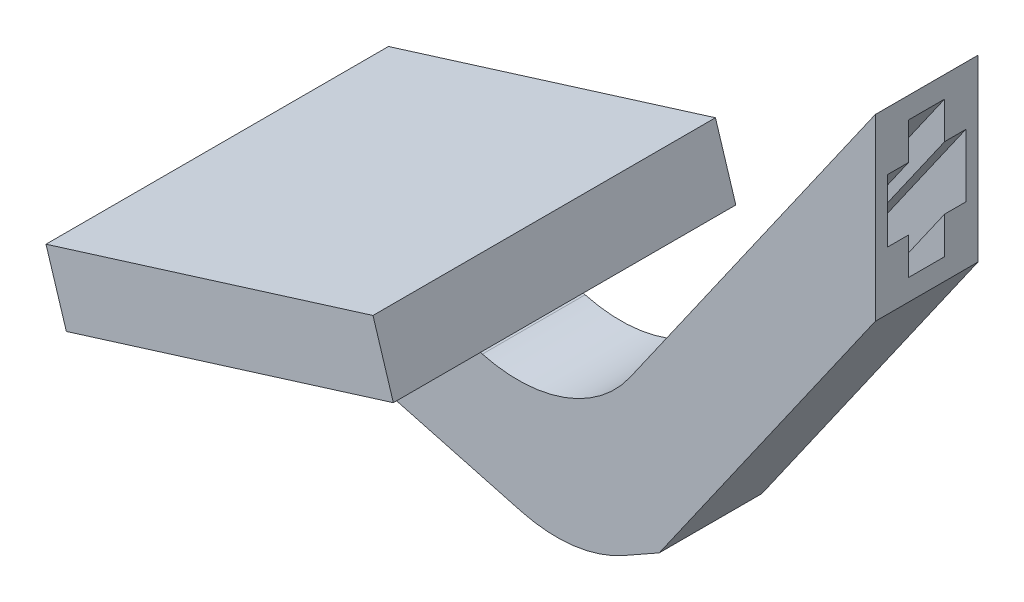
ISO-10303-21;
HEADER;
FILE_DESCRIPTION(('STEP AP214'),'2;1');
FILE_NAME('part.step','',(''),(''),'','','');
FILE_SCHEMA(('AUTOMOTIVE_DESIGN { 1 0 10303 214 1 1 1 1 }'));
ENDSEC;
DATA;
#1=APPLICATION_CONTEXT('core data for automotive mechanical design processes');
#2=APPLICATION_PROTOCOL_DEFINITION('international standard','automotive_design',2000,#1);
#3=PRODUCT_CONTEXT('',#1,'mechanical');
#4=PRODUCT('Part','Part','',(#3));
#5=PRODUCT_RELATED_PRODUCT_CATEGORY('part','',(#4));
#6=PRODUCT_DEFINITION_FORMATION('','',#4);
#7=PRODUCT_DEFINITION_CONTEXT('part definition',#1,'design');
#8=PRODUCT_DEFINITION('design','',#6,#7);
#9=PRODUCT_DEFINITION_SHAPE('','',#8);
#10=(LENGTH_UNIT() NAMED_UNIT(*) SI_UNIT(.MILLI.,.METRE.));
#11=(NAMED_UNIT(*) PLANE_ANGLE_UNIT() SI_UNIT($,.RADIAN.));
#12=(NAMED_UNIT(*) SI_UNIT($,.STERADIAN.) SOLID_ANGLE_UNIT());
#13=UNCERTAINTY_MEASURE_WITH_UNIT(LENGTH_MEASURE(1.E-05),#10,'distance_accuracy_value','');
#14=(GEOMETRIC_REPRESENTATION_CONTEXT(3) GLOBAL_UNCERTAINTY_ASSIGNED_CONTEXT((#13)) GLOBAL_UNIT_ASSIGNED_CONTEXT((#10,
#11,#12)) REPRESENTATION_CONTEXT('',''));
#15=CARTESIAN_POINT('',(0.,0.,0.));
#16=DIRECTION('',(0.,0.,1.));
#17=DIRECTION('',(1.,0.,0.));
#18=AXIS2_PLACEMENT_3D('',#15,#16,#17);
#19=CARTESIAN_POINT('',(-87.1977369383555,0.,17.5));
#20=DIRECTION('',(-1.,0.,0.));
#21=DIRECTION('',(0.,0.,1.));
#22=AXIS2_PLACEMENT_3D('',#19,#20,#21);
#23=PLANE('',#22);
#24=DIRECTION('',(0.,-1.,0.));
#25=VECTOR('',#24,1.);
#26=CARTESIAN_POINT('',(-87.1977369383555,-19.5936198643126,5.25));
#27=LINE('',#26,#25);
#28=CARTESIAN_POINT('',(-87.1977369383555,-42.8393625791956,5.25));
#29=VERTEX_POINT('',#28);
#30=CARTESIAN_POINT('',(-87.1977369383555,-61.1455539332173,5.25));
#31=VERTEX_POINT('',#30);
#32=EDGE_CURVE('E278',#29,#31,#27,.T.);
#33=ORIENTED_EDGE('',*,*,#32,.T.);
#34=DIRECTION('',(0.,0.,-1.));
#35=VECTOR('',#34,1.);
#36=CARTESIAN_POINT('',(-87.1977369383555,-61.1455539332173,17.5));
#37=LINE('',#36,#35);
#38=CARTESIAN_POINT('',(-87.1977369383555,-61.1455539332173,-5.25));
#39=VERTEX_POINT('',#38);
#40=EDGE_CURVE('E274',#31,#39,#37,.T.);
#41=ORIENTED_EDGE('',*,*,#40,.T.);
#42=DIRECTION('',(0.,1.,0.));
#43=VECTOR('',#42,1.);
#44=CARTESIAN_POINT('',(-87.1977369383555,0.,-5.25));
#45=LINE('',#44,#43);
#46=CARTESIAN_POINT('',(-87.1977369383555,-42.8393625791956,-5.25));
#47=VERTEX_POINT('',#46);
#48=EDGE_CURVE('E277',#39,#47,#45,.T.);
#49=ORIENTED_EDGE('',*,*,#48,.T.);
#50=DIRECTION('',(0.,0.,-1.));
#51=VECTOR('',#50,1.);
#52=CARTESIAN_POINT('',(-87.1977369383555,-42.8393625791956,17.5));
#53=LINE('',#52,#51);
#54=EDGE_CURVE('E197',#29,#47,#53,.T.);
#55=ORIENTED_EDGE('',*,*,#54,.F.);
#56=EDGE_LOOP('',(#33,#41,#49,#55));
#57=FACE_BOUND('',#56,.T.);
#58=DIRECTION('',(0.,1.,0.));
#59=VECTOR('',#58,1.);
#60=CARTESIAN_POINT('',(-87.1977369383555,0.,-1.84000000000011));
#61=LINE('',#60,#59);
#62=CARTESIAN_POINT('',(-87.1977369383555,-58.9662454386908,-1.84000000000017));
#63=VERTEX_POINT('',#62);
#64=CARTESIAN_POINT('',(-87.1977369383555,-55.2004003601493,-1.84000000000014));
#65=VERTEX_POINT('',#64);
#66=EDGE_CURVE('E12',#63,#65,#61,.T.);
#67=ORIENTED_EDGE('',*,*,#66,.F.);
#68=DIRECTION('',(0.,0.,1.));
#69=VECTOR('',#68,1.);
#70=CARTESIAN_POINT('',(-87.1977369383555,-58.9662454386908,17.5));
#71=LINE('',#70,#69);
#72=CARTESIAN_POINT('',(-87.1977369383555,-58.9662454386908,1.83999999999985));
#73=VERTEX_POINT('',#72);
#74=EDGE_CURVE('E182',#63,#73,#71,.T.);
#75=ORIENTED_EDGE('',*,*,#74,.T.);
#76=DIRECTION('',(0.,1.,0.));
#77=VECTOR('',#76,1.);
#78=CARTESIAN_POINT('',(-87.1977369383555,0.,1.83999999999989));
#79=LINE('',#78,#77);
#80=CARTESIAN_POINT('',(-87.1977369383555,-55.2004003601493,1.83999999999985));
#81=VERTEX_POINT('',#80);
#82=EDGE_CURVE('E388',#73,#81,#79,.T.);
#83=ORIENTED_EDGE('',*,*,#82,.T.);
#84=DIRECTION('',(0.,0.,1.));
#85=VECTOR('',#84,1.);
#86=CARTESIAN_POINT('',(-87.1977369383555,-55.2004003601492,17.5000000000001));
#87=LINE('',#86,#85);
#88=CARTESIAN_POINT('',(-87.1977369383555,-55.2004003601493,3.99999999999985));
#89=VERTEX_POINT('',#88);
#90=EDGE_CURVE('E385',#81,#89,#87,.T.);
#91=ORIENTED_EDGE('',*,*,#90,.T.);
#92=DIRECTION('',(0.,1.,0.));
#93=VECTOR('',#92,1.);
#94=CARTESIAN_POINT('',(-87.1977369383555,0.,3.99999999999988));
#95=LINE('',#94,#93);
#96=CARTESIAN_POINT('',(-87.1977369383555,-48.7845161522636,3.99999999999987));
#97=VERTEX_POINT('',#96);
#98=EDGE_CURVE('E382',#89,#97,#95,.T.);
#99=ORIENTED_EDGE('',*,*,#98,.T.);
#100=DIRECTION('',(0.,0.,1.));
#101=VECTOR('',#100,1.);
#102=CARTESIAN_POINT('',(-87.1977369383555,-48.7845161522636,17.5));
#103=LINE('',#102,#101);
#104=CARTESIAN_POINT('',(-87.1977369383555,-48.7845161522636,1.83999999999985));
#105=VERTEX_POINT('',#104);
#106=EDGE_CURVE('E379',#105,#97,#103,.T.);
#107=ORIENTED_EDGE('',*,*,#106,.F.);
#108=DIRECTION('',(0.,1.,0.));
#109=VECTOR('',#108,1.);
#110=CARTESIAN_POINT('',(-87.1977369383555,0.,1.83999999999989));
#111=LINE('',#110,#109);
#112=CARTESIAN_POINT('',(-87.1977369383555,-45.018671073722,1.83999999999987));
#113=VERTEX_POINT('',#112);
#114=EDGE_CURVE('E376',#105,#113,#111,.T.);
#115=ORIENTED_EDGE('',*,*,#114,.T.);
#116=DIRECTION('',(0.,0.,1.));
#117=VECTOR('',#116,1.);
#118=CARTESIAN_POINT('',(-87.1977369383555,-45.018671073722,17.5));
#119=LINE('',#118,#117);
#120=CARTESIAN_POINT('',(-87.1977369383555,-45.018671073722,-1.84000000000015));
#121=VERTEX_POINT('',#120);
#122=EDGE_CURVE('E373',#121,#113,#119,.T.);
#123=ORIENTED_EDGE('',*,*,#122,.F.);
#124=DIRECTION('',(0.,1.,0.));
#125=VECTOR('',#124,1.);
#126=CARTESIAN_POINT('',(-87.1977369383555,0.,-1.84000000000011));
#127=LINE('',#126,#125);
#128=CARTESIAN_POINT('',(-87.1977369383555,-48.7845161522636,-1.84000000000015));
#129=VERTEX_POINT('',#128);
#130=EDGE_CURVE('E370',#129,#121,#127,.T.);
#131=ORIENTED_EDGE('',*,*,#130,.F.);
#132=DIRECTION('',(0.,0.,1.));
#133=VECTOR('',#132,1.);
#134=CARTESIAN_POINT('',(-87.1977369383555,-48.7845161522636,17.5));
#135=LINE('',#134,#133);
#136=CARTESIAN_POINT('',(-87.1977369383555,-48.7845161522636,-4.00000000000016));
#137=VERTEX_POINT('',#136);
#138=EDGE_CURVE('E367',#137,#129,#135,.T.);
#139=ORIENTED_EDGE('',*,*,#138,.F.);
#140=DIRECTION('',(0.,1.,0.));
#141=VECTOR('',#140,1.);
#142=CARTESIAN_POINT('',(-87.1977369383555,0.,-4.00000000000012));
#143=LINE('',#142,#141);
#144=CARTESIAN_POINT('',(-87.1977369383555,-55.2004003601493,-4.00000000000017));
#145=VERTEX_POINT('',#144);
#146=EDGE_CURVE('E364',#145,#137,#143,.T.);
#147=ORIENTED_EDGE('',*,*,#146,.F.);
#148=DIRECTION('',(0.,0.,1.));
#149=VECTOR('',#148,1.);
#150=CARTESIAN_POINT('',(-87.1977369383555,-55.2004003601492,17.5000000000001));
#151=LINE('',#150,#149);
#152=EDGE_CURVE('E291',#145,#65,#151,.T.);
#153=ORIENTED_EDGE('',*,*,#152,.T.);
#154=EDGE_LOOP('',(#67,#75,#83,#91,#99,#107,#115,#123,#131,#139,#147,#153));
#155=FACE_BOUND('',#154,.T.);
#156=ADVANCED_FACE('F175',(#57,#155),#23,.F.);
#157=CARTESIAN_POINT('',(-76.0767929010446,-19.5936198643126,-5.25));
#158=DIRECTION('',(0.,0.,-1.));
#159=DIRECTION('',(-1.,-3.63042929052426E-13,0.));
#160=AXIS2_PLACEMENT_3D('',#157,#158,#159);
#161=PLANE('',#160);
#162=ORIENTED_EDGE('',*,*,#48,.F.);
#163=DIRECTION('',(-0.573576436351044,-0.819152044288993,0.));
#164=VECTOR('',#163,1.);
#165=CARTESIAN_POINT('',(-50.198458454352,-8.30510811539095,-5.25));
#166=LINE('',#165,#164);
#167=CARTESIAN_POINT('',(-109.280511790734,-92.6830248219769,-5.25));
#168=VERTEX_POINT('',#167);
#169=EDGE_CURVE('E287',#39,#168,#166,.T.);
#170=ORIENTED_EDGE('',*,*,#169,.T.);
#171=DIRECTION('',(0.871154090420245,0.491009725712308,0.));
#172=VECTOR('',#171,1.);
#173=CARTESIAN_POINT('',(-20.944061808536,-42.8938353397413,-5.25));
#174=LINE('',#173,#172);
#175=CARTESIAN_POINT('',(-112.90358333254,-94.7251014000941,-5.25));
#176=VERTEX_POINT('',#175);
#177=EDGE_CURVE('E309',#176,#168,#174,.T.);
#178=ORIENTED_EDGE('',*,*,#177,.F.);
#179=CARTESIAN_POINT('',(-119.777719492512,-82.5289441342107,-5.25));
#180=DIRECTION('',(0.,0.,-1.));
#181=DIRECTION('',(-1.,0.,0.));
#182=AXIS2_PLACEMENT_3D('',#179,#180,#181);
#183=CIRCLE('',#182,14.);
#184=CARTESIAN_POINT('',(-123.401186123948,-96.0519057022576,-5.25));
#185=VERTEX_POINT('',#184);
#186=EDGE_CURVE('E297',#176,#185,#183,.T.);
#187=ORIENTED_EDGE('',*,*,#186,.T.);
#188=DIRECTION('',(-0.96592582628907,0.258819045102514,0.));
#189=VECTOR('',#188,1.);
#190=CARTESIAN_POINT('',(-59.1749641176493,-113.261270021747,-5.25));
#191=LINE('',#190,#189);
#192=CARTESIAN_POINT('',(-150.293052318357,-88.8462518725002,-5.25));
#193=VERTEX_POINT('',#192);
#194=EDGE_CURVE('E300',#185,#193,#191,.T.);
#195=ORIENTED_EDGE('',*,*,#194,.T.);
#196=DIRECTION('',(0.954811797841029,0.297211087787083,0.));
#197=VECTOR('',#196,1.);
#198=CARTESIAN_POINT('',(-150.293052318357,-88.8462518725002,-5.25));
#199=LINE('',#198,#197);
#200=CARTESIAN_POINT('',(-131.525949988818,-83.0044818916663,-5.25));
#201=VERTEX_POINT('',#200);
#202=EDGE_CURVE('E314',#193,#201,#199,.T.);
#203=ORIENTED_EDGE('',*,*,#202,.T.);
#204=DIRECTION('',(-0.96592582628907,0.258819045102514,0.));
#205=VECTOR('',#204,1.);
#206=CARTESIAN_POINT('',(-56.4573641440729,-103.119048845712,-5.25));
#207=LINE('',#206,#205);
#208=CARTESIAN_POINT('',(-127.350487884635,-84.1232935905088,-5.25));
#209=VERTEX_POINT('',#208);
#210=EDGE_CURVE('E315',#209,#201,#207,.T.);
#211=ORIENTED_EDGE('',*,*,#210,.F.);
#212=CARTESIAN_POINT('',(-123.7270212532,-70.6003320224618,-5.25));
#213=DIRECTION('',(0.,0.,-1.));
#214=DIRECTION('',(-1.,0.,0.));
#215=AXIS2_PLACEMENT_3D('',#212,#213,#214);
#216=CIRCLE('',#215,14.);
#217=CARTESIAN_POINT('',(-112.258892633154,-78.6304021313765,-5.25));
#218=VERTEX_POINT('',#217);
#219=EDGE_CURVE('E321',#209,#218,#216,.F.);
#220=ORIENTED_EDGE('',*,*,#219,.T.);
#221=DIRECTION('',(0.573576436351044,0.819152044288994,0.));
#222=VECTOR('',#221,1.);
#223=CARTESIAN_POINT('',(-58.7995549193865,-2.28255553370498,-5.25));
#224=LINE('',#223,#222);
#225=EDGE_CURVE('E290',#218,#47,#224,.T.);
#226=ORIENTED_EDGE('',*,*,#225,.T.);
#227=EDGE_LOOP('',(#162,#170,#178,#187,#195,#203,#211,#220,#226));
#228=FACE_BOUND('',#227,.T.);
#229=ADVANCED_FACE('F285',(#228),#161,.T.);
#230=CARTESIAN_POINT('',(-50.198458454352,-8.30510811539095,100.697652672067));
#231=DIRECTION('',(0.819152044288993,-0.573576436351044,0.));
#232=DIRECTION('',(0.573576436351044,0.819152044288993,0.));
#233=AXIS2_PLACEMENT_3D('',#230,#231,#232);
#234=PLANE('',#233);
#235=ORIENTED_EDGE('',*,*,#40,.F.);
#236=DIRECTION('',(-0.573576436351044,-0.819152044288993,0.));
#237=VECTOR('',#236,1.);
#238=CARTESIAN_POINT('',(-50.198458454352,-8.30510811539095,5.25));
#239=LINE('',#238,#237);
#240=CARTESIAN_POINT('',(-109.280511790734,-92.6830248219769,5.25));
#241=VERTEX_POINT('',#240);
#242=EDGE_CURVE('E307',#31,#241,#239,.T.);
#243=ORIENTED_EDGE('',*,*,#242,.T.);
#244=DIRECTION('',(0.,0.,-1.));
#245=VECTOR('',#244,1.);
#246=CARTESIAN_POINT('',(-109.280511790734,-92.6830248219769,100.697652672067));
#247=LINE('',#246,#245);
#248=EDGE_CURVE('E296',#241,#168,#247,.T.);
#249=ORIENTED_EDGE('',*,*,#248,.T.);
#250=ORIENTED_EDGE('',*,*,#169,.F.);
#251=EDGE_LOOP('',(#235,#243,#249,#250));
#252=FACE_BOUND('',#251,.T.);
#253=ADVANCED_FACE('F294',(#252),#234,.T.);
#254=CARTESIAN_POINT('',(-20.944061808536,-42.8938353397413,100.697652672067));
#255=DIRECTION('',(-0.491009725712308,0.871154090420245,0.));
#256=DIRECTION('',(-0.871154090420245,-0.491009725712308,0.));
#257=AXIS2_PLACEMENT_3D('',#254,#255,#256);
#258=PLANE('',#257);
#259=DIRECTION('',(0.871154090420245,0.491009725712308,0.));
#260=VECTOR('',#259,1.);
#261=CARTESIAN_POINT('',(-20.944061808536,-42.8938353397413,5.25));
#262=LINE('',#261,#260);
#263=CARTESIAN_POINT('',(-112.90358333254,-94.7251014000941,5.25));
#264=VERTEX_POINT('',#263);
#265=EDGE_CURVE('E352',#264,#241,#262,.T.);
#266=ORIENTED_EDGE('',*,*,#265,.F.);
#267=DIRECTION('',(0.,0.,-1.));
#268=VECTOR('',#267,1.);
#269=CARTESIAN_POINT('',(-112.90358333254,-94.7251014000941,-5.25));
#270=LINE('',#269,#268);
#271=EDGE_CURVE('E312',#264,#176,#270,.T.);
#272=ORIENTED_EDGE('',*,*,#271,.T.);
#273=ORIENTED_EDGE('',*,*,#177,.T.);
#274=ORIENTED_EDGE('',*,*,#248,.F.);
#275=EDGE_LOOP('',(#266,#272,#273,#274));
#276=FACE_BOUND('',#275,.T.);
#277=ADVANCED_FACE('F507',(#276),#258,.F.);
#278=CARTESIAN_POINT('',(-59.1749641176493,-113.261270021747,100.697652672067));
#279=DIRECTION('',(-0.258819045102514,-0.96592582628907,0.));
#280=DIRECTION('',(0.96592582628907,-0.258819045102514,0.));
#281=AXIS2_PLACEMENT_3D('',#278,#279,#280);
#282=PLANE('',#281);
#283=ORIENTED_EDGE('',*,*,#194,.F.);
#284=DIRECTION('',(0.,0.,-1.));
#285=VECTOR('',#284,1.);
#286=CARTESIAN_POINT('',(-123.401186123948,-96.0519057022576,5.25));
#287=LINE('',#286,#285);
#288=CARTESIAN_POINT('',(-123.401186123948,-96.0519057022576,5.25));
#289=VERTEX_POINT('',#288);
#290=EDGE_CURVE('E311',#185,#289,#287,.F.);
#291=ORIENTED_EDGE('',*,*,#290,.T.);
#292=DIRECTION('',(-0.96592582628907,0.258819045102514,0.));
#293=VECTOR('',#292,1.);
#294=CARTESIAN_POINT('',(-59.1749641176493,-113.261270021747,5.25));
#295=LINE('',#294,#293);
#296=CARTESIAN_POINT('',(-150.293052318357,-88.8462518725002,5.25));
#297=VERTEX_POINT('',#296);
#298=EDGE_CURVE('E488',#289,#297,#295,.T.);
#299=ORIENTED_EDGE('',*,*,#298,.T.);
#300=DIRECTION('',(0.,0.,-1.));
#301=VECTOR('',#300,1.);
#302=CARTESIAN_POINT('',(-150.293052318357,-88.8462518725002,100.697652672067));
#303=LINE('',#302,#301);
#304=EDGE_CURVE('E319',#297,#193,#303,.T.);
#305=ORIENTED_EDGE('',*,*,#304,.T.);
#306=EDGE_LOOP('',(#283,#291,#299,#305));
#307=FACE_BOUND('',#306,.T.);
#308=ADVANCED_FACE('F512',(#307),#282,.T.);
#309=CARTESIAN_POINT('',(-56.4573641440729,-103.119048845712,100.697652672067));
#310=DIRECTION('',(-0.258819045102514,-0.96592582628907,0.));
#311=DIRECTION('',(0.96592582628907,-0.258819045102514,0.));
#312=AXIS2_PLACEMENT_3D('',#309,#310,#311);
#313=PLANE('',#312);
#314=ORIENTED_EDGE('',*,*,#210,.T.);
#315=DIRECTION('',(0.,0.,1.));
#316=VECTOR('',#315,1.);
#317=CARTESIAN_POINT('',(-131.525949988818,-83.0044818916663,-5.25));
#318=LINE('',#317,#316);
#319=CARTESIAN_POINT('',(-131.525949988818,-83.0044818916664,5.25));
#320=VERTEX_POINT('',#319);
#321=EDGE_CURVE('E318',#201,#320,#318,.T.);
#322=ORIENTED_EDGE('',*,*,#321,.T.);
#323=DIRECTION('',(-0.96592582628907,0.258819045102514,0.));
#324=VECTOR('',#323,1.);
#325=CARTESIAN_POINT('',(-56.4573641440729,-103.119048845712,5.25));
#326=LINE('',#325,#324);
#327=CARTESIAN_POINT('',(-127.350487884635,-84.1232935905088,5.25));
#328=VERTEX_POINT('',#327);
#329=EDGE_CURVE('E480',#328,#320,#326,.T.);
#330=ORIENTED_EDGE('',*,*,#329,.F.);
#331=DIRECTION('',(0.,0.,-1.));
#332=VECTOR('',#331,1.);
#333=CARTESIAN_POINT('',(-127.350487884635,-84.1232935905088,100.697652672067));
#334=LINE('',#333,#332);
#335=EDGE_CURVE('E329',#328,#209,#334,.T.);
#336=ORIENTED_EDGE('',*,*,#335,.T.);
#337=EDGE_LOOP('',(#314,#322,#330,#336));
#338=FACE_BOUND('',#337,.T.);
#339=ADVANCED_FACE('F806',(#338),#313,.F.);
#340=CARTESIAN_POINT('',(-58.7995549193865,-2.28255553370498,100.697652672067));
#341=DIRECTION('',(-0.819152044288993,0.573576436351044,0.));
#342=DIRECTION('',(-0.573576436351044,-0.819152044288994,0.));
#343=AXIS2_PLACEMENT_3D('',#340,#341,#342);
#344=PLANE('',#343);
#345=ORIENTED_EDGE('',*,*,#54,.T.);
#346=ORIENTED_EDGE('',*,*,#225,.F.);
#347=DIRECTION('',(0.,0.,-1.));
#348=VECTOR('',#347,1.);
#349=CARTESIAN_POINT('',(-112.258892633154,-78.6304021313764,100.697652672067));
#350=LINE('',#349,#348);
#351=CARTESIAN_POINT('',(-112.258892633154,-78.6304021313765,5.25));
#352=VERTEX_POINT('',#351);
#353=EDGE_CURVE('E360',#218,#352,#350,.F.);
#354=ORIENTED_EDGE('',*,*,#353,.T.);
#355=DIRECTION('',(0.573576436351044,0.819152044288994,0.));
#356=VECTOR('',#355,1.);
#357=CARTESIAN_POINT('',(-58.7995549193865,-2.28255553370498,5.25));
#358=LINE('',#357,#356);
#359=EDGE_CURVE('E481',#352,#29,#358,.T.);
#360=ORIENTED_EDGE('',*,*,#359,.T.);
#361=EDGE_LOOP('',(#345,#346,#354,#360));
#362=FACE_BOUND('',#361,.T.);
#363=ADVANCED_FACE('F526',(#362),#344,.T.);
#364=CARTESIAN_POINT('',(-76.0767929010446,-19.5936198643126,5.25));
#365=DIRECTION('',(0.,0.,1.));
#366=DIRECTION('',(-1.,-3.63042929052426E-13,0.));
#367=AXIS2_PLACEMENT_3D('',#364,#365,#366);
#368=PLANE('',#367);
#369=ORIENTED_EDGE('',*,*,#32,.F.);
#370=ORIENTED_EDGE('',*,*,#359,.F.);
#371=CARTESIAN_POINT('',(-123.7270212532,-70.6003320224618,5.25));
#372=DIRECTION('',(0.,0.,1.));
#373=DIRECTION('',(1.,0.,0.));
#374=AXIS2_PLACEMENT_3D('',#371,#372,#373);
#375=CIRCLE('',#374,14.);
#376=EDGE_CURVE('E478',#352,#328,#375,.F.);
#377=ORIENTED_EDGE('',*,*,#376,.T.);
#378=ORIENTED_EDGE('',*,*,#329,.T.);
#379=DIRECTION('',(0.954811797841029,0.297211087787083,0.));
#380=VECTOR('',#379,1.);
#381=CARTESIAN_POINT('',(-150.293052318357,-88.8462518725002,5.25));
#382=LINE('',#381,#380);
#383=EDGE_CURVE('E323',#297,#320,#382,.T.);
#384=ORIENTED_EDGE('',*,*,#383,.F.);
#385=ORIENTED_EDGE('',*,*,#298,.F.);
#386=CARTESIAN_POINT('',(-119.777719492512,-82.5289441342107,5.25));
#387=DIRECTION('',(0.,0.,1.));
#388=DIRECTION('',(1.,0.,0.));
#389=AXIS2_PLACEMENT_3D('',#386,#387,#388);
#390=CIRCLE('',#389,14.);
#391=EDGE_CURVE('E486',#289,#264,#390,.T.);
#392=ORIENTED_EDGE('',*,*,#391,.T.);
#393=ORIENTED_EDGE('',*,*,#265,.T.);
#394=ORIENTED_EDGE('',*,*,#242,.F.);
#395=EDGE_LOOP('',(#369,#370,#377,#378,#384,#385,#392,#393,#394));
#396=FACE_BOUND('',#395,.T.);
#397=ADVANCED_FACE('F502',(#396),#368,.T.);
#398=CARTESIAN_POINT('',(-119.777719492512,-82.5289441342107,100.697652672067));
#399=DIRECTION('',(0.,0.,1.));
#400=DIRECTION('',(1.,0.,0.));
#401=AXIS2_PLACEMENT_3D('',#398,#399,#400);
#402=CYLINDRICAL_SURFACE('',#401,14.);
#403=ORIENTED_EDGE('',*,*,#391,.F.);
#404=ORIENTED_EDGE('',*,*,#290,.F.);
#405=ORIENTED_EDGE('',*,*,#186,.F.);
#406=ORIENTED_EDGE('',*,*,#271,.F.);
#407=EDGE_LOOP('',(#403,#404,#405,#406));
#408=FACE_BOUND('',#407,.T.);
#409=ADVANCED_FACE('F515',(#408),#402,.T.);
#410=CARTESIAN_POINT('',(-123.7270212532,-70.6003320224618,100.697652672067));
#411=DIRECTION('',(0.,0.,-1.));
#412=DIRECTION('',(-1.,0.,0.));
#413=AXIS2_PLACEMENT_3D('',#410,#411,#412);
#414=CYLINDRICAL_SURFACE('',#413,14.);
#415=ORIENTED_EDGE('',*,*,#376,.F.);
#416=ORIENTED_EDGE('',*,*,#353,.F.);
#417=ORIENTED_EDGE('',*,*,#219,.F.);
#418=ORIENTED_EDGE('',*,*,#335,.F.);
#419=EDGE_LOOP('',(#415,#416,#417,#418));
#420=FACE_BOUND('',#419,.T.);
#421=ADVANCED_FACE('F517',(#420),#414,.F.);
#422=CARTESIAN_POINT('',(-126.280772305879,-74.0404902609221,17.5));
#423=DIRECTION('',(-0.954811797841029,-0.297211087787083,0.));
#424=DIRECTION('',(0.297211087787083,-0.954811797841029,0.));
#425=AXIS2_PLACEMENT_3D('',#422,#423,#424);
#426=PLANE('',#425);
#427=DIRECTION('',(0.,0.,-1.));
#428=VECTOR('',#427,1.);
#429=CARTESIAN_POINT('',(-124.200294691369,-80.7241728458093,17.5));
#430=LINE('',#429,#428);
#431=CARTESIAN_POINT('',(-124.200294691369,-80.7241728458093,17.5));
#432=VERTEX_POINT('',#431);
#433=CARTESIAN_POINT('',(-124.200294691369,-80.7241728458093,-17.5));
#434=VERTEX_POINT('',#433);
#435=EDGE_CURVE('E346',#432,#434,#430,.T.);
#436=ORIENTED_EDGE('',*,*,#435,.T.);
#437=DIRECTION('',(0.297211087787083,-0.954811797841029,0.));
#438=VECTOR('',#437,1.);
#439=CARTESIAN_POINT('',(-126.280772305879,-74.0404902609221,-17.5));
#440=LINE('',#439,#438);
#441=CARTESIAN_POINT('',(-126.280772305879,-74.0404902609221,-17.5));
#442=VERTEX_POINT('',#441);
#443=EDGE_CURVE('E330',#442,#434,#440,.T.);
#444=ORIENTED_EDGE('',*,*,#443,.F.);
#445=DIRECTION('',(0.,0.,-1.));
#446=VECTOR('',#445,1.);
#447=CARTESIAN_POINT('',(-126.280772305879,-74.0404902609221,17.5));
#448=LINE('',#447,#446);
#449=CARTESIAN_POINT('',(-126.280772305879,-74.0404902609221,17.5));
#450=VERTEX_POINT('',#449);
#451=EDGE_CURVE('E342',#450,#442,#448,.T.);
#452=ORIENTED_EDGE('',*,*,#451,.F.);
#453=DIRECTION('',(0.297211087787083,-0.954811797841029,0.));
#454=VECTOR('',#453,1.);
#455=CARTESIAN_POINT('',(-126.280772305879,-74.0404902609221,17.5));
#456=LINE('',#455,#454);
#457=EDGE_CURVE('E343',#450,#432,#456,.T.);
#458=ORIENTED_EDGE('',*,*,#457,.T.);
#459=EDGE_LOOP('',(#436,#444,#452,#458));
#460=FACE_BOUND('',#459,.T.);
#461=ADVANCED_FACE('F523',(#460),#426,.F.);
#462=CARTESIAN_POINT('',(-159.699185230315,-84.44287833347,-17.5));
#463=DIRECTION('',(0.,0.,1.));
#464=DIRECTION('',(1.,0.,0.));
#465=AXIS2_PLACEMENT_3D('',#462,#463,#464);
#466=PLANE('',#465);
#467=DIRECTION('',(-0.954811797841029,-0.297211087787083,0.));
#468=VECTOR('',#467,1.);
#469=CARTESIAN_POINT('',(-157.618707615805,-91.1265609183572,-17.5));
#470=LINE('',#469,#468);
#471=CARTESIAN_POINT('',(-157.618707615805,-91.1265609183572,-17.5));
#472=VERTEX_POINT('',#471);
#473=EDGE_CURVE('E334',#434,#472,#470,.T.);
#474=ORIENTED_EDGE('',*,*,#473,.T.);
#475=DIRECTION('',(0.297211087787083,-0.954811797841029,0.));
#476=VECTOR('',#475,1.);
#477=CARTESIAN_POINT('',(-159.699185230315,-84.44287833347,-17.5));
#478=LINE('',#477,#476);
#479=CARTESIAN_POINT('',(-159.699185230315,-84.44287833347,-17.5));
#480=VERTEX_POINT('',#479);
#481=EDGE_CURVE('E335',#480,#472,#478,.T.);
#482=ORIENTED_EDGE('',*,*,#481,.F.);
#483=DIRECTION('',(-0.954811797841029,-0.297211087787083,0.));
#484=VECTOR('',#483,1.);
#485=CARTESIAN_POINT('',(-159.699185230315,-84.44287833347,-17.5));
#486=LINE('',#485,#484);
#487=EDGE_CURVE('E356',#442,#480,#486,.T.);
#488=ORIENTED_EDGE('',*,*,#487,.F.);
#489=ORIENTED_EDGE('',*,*,#443,.T.);
#490=EDGE_LOOP('',(#474,#482,#488,#489));
#491=FACE_BOUND('',#490,.T.);
#492=ADVANCED_FACE('F541',(#491),#466,.F.);
#493=CARTESIAN_POINT('',(-159.699185230315,-84.44287833347,17.5));
#494=DIRECTION('',(0.954811797841029,0.297211087787083,0.));
#495=DIRECTION('',(-0.297211087787083,0.954811797841029,0.));
#496=AXIS2_PLACEMENT_3D('',#493,#494,#495);
#497=PLANE('',#496);
#498=DIRECTION('',(0.,0.,1.));
#499=VECTOR('',#498,1.);
#500=CARTESIAN_POINT('',(-157.618707615805,-91.1265609183572,17.5));
#501=LINE('',#500,#499);
#502=CARTESIAN_POINT('',(-157.618707615805,-91.1265609183572,17.5));
#503=VERTEX_POINT('',#502);
#504=EDGE_CURVE('E333',#472,#503,#501,.T.);
#505=ORIENTED_EDGE('',*,*,#504,.T.);
#506=DIRECTION('',(0.297211087787083,-0.954811797841029,0.));
#507=VECTOR('',#506,1.);
#508=CARTESIAN_POINT('',(-159.699185230315,-84.44287833347,17.5));
#509=LINE('',#508,#507);
#510=CARTESIAN_POINT('',(-159.699185230315,-84.44287833347,17.5));
#511=VERTEX_POINT('',#510);
#512=EDGE_CURVE('E339',#511,#503,#509,.T.);
#513=ORIENTED_EDGE('',*,*,#512,.F.);
#514=DIRECTION('',(0.,0.,1.));
#515=VECTOR('',#514,1.);
#516=CARTESIAN_POINT('',(-159.699185230315,-84.44287833347,17.5));
#517=LINE('',#516,#515);
#518=EDGE_CURVE('E354',#480,#511,#517,.T.);
#519=ORIENTED_EDGE('',*,*,#518,.F.);
#520=ORIENTED_EDGE('',*,*,#481,.T.);
#521=EDGE_LOOP('',(#505,#513,#519,#520));
#522=FACE_BOUND('',#521,.T.);
#523=ADVANCED_FACE('F545',(#522),#497,.F.);
#524=CARTESIAN_POINT('',(-159.699185230315,-84.44287833347,17.5));
#525=DIRECTION('',(0.,0.,-1.));
#526=DIRECTION('',(-1.,0.,0.));
#527=AXIS2_PLACEMENT_3D('',#524,#525,#526);
#528=PLANE('',#527);
#529=DIRECTION('',(0.954811797841029,0.297211087787083,0.));
#530=VECTOR('',#529,1.);
#531=CARTESIAN_POINT('',(-157.618707615805,-91.1265609183572,17.5));
#532=LINE('',#531,#530);
#533=EDGE_CURVE('E338',#503,#432,#532,.T.);
#534=ORIENTED_EDGE('',*,*,#533,.T.);
#535=ORIENTED_EDGE('',*,*,#457,.F.);
#536=DIRECTION('',(0.954811797841029,0.297211087787083,0.));
#537=VECTOR('',#536,1.);
#538=CARTESIAN_POINT('',(-159.699185230315,-84.44287833347,17.5));
#539=LINE('',#538,#537);
#540=EDGE_CURVE('E326',#511,#450,#539,.T.);
#541=ORIENTED_EDGE('',*,*,#540,.F.);
#542=ORIENTED_EDGE('',*,*,#512,.T.);
#543=EDGE_LOOP('',(#534,#535,#541,#542));
#544=FACE_BOUND('',#543,.T.);
#545=ADVANCED_FACE('F549',(#544),#528,.F.);
#546=CARTESIAN_POINT('',(-26.7706104917019,-43.0652514698485,0.));
#547=DIRECTION('',(0.297211087787083,-0.954811797841029,0.));
#548=DIRECTION('',(0.954811797841029,0.297211087787083,0.));
#549=AXIS2_PLACEMENT_3D('',#546,#547,#548);
#550=PLANE('',#549);
#551=ORIENTED_EDGE('',*,*,#451,.T.);
#552=ORIENTED_EDGE('',*,*,#487,.T.);
#553=ORIENTED_EDGE('',*,*,#518,.T.);
#554=ORIENTED_EDGE('',*,*,#540,.T.);
#555=EDGE_LOOP('',(#551,#552,#553,#554));
#556=FACE_BOUND('',#555,.T.);
#557=ADVANCED_FACE('F553',(#556),#550,.F.);
#558=CARTESIAN_POINT('',(-24.6901328771923,-49.7489340547357,0.));
#559=DIRECTION('',(0.297211087787083,-0.954811797841029,0.));
#560=DIRECTION('',(0.954811797841029,0.297211087787083,0.));
#561=AXIS2_PLACEMENT_3D('',#558,#559,#560);
#562=PLANE('',#561);
#563=ORIENTED_EDGE('',*,*,#321,.F.);
#564=ORIENTED_EDGE('',*,*,#202,.F.);
#565=ORIENTED_EDGE('',*,*,#304,.F.);
#566=ORIENTED_EDGE('',*,*,#383,.T.);
#567=EDGE_LOOP('',(#563,#564,#565,#566));
#568=FACE_BOUND('',#567,.T.);
#569=ORIENTED_EDGE('',*,*,#435,.F.);
#570=ORIENTED_EDGE('',*,*,#533,.F.);
#571=ORIENTED_EDGE('',*,*,#504,.F.);
#572=ORIENTED_EDGE('',*,*,#473,.F.);
#573=EDGE_LOOP('',(#569,#570,#571,#572));
#574=FACE_BOUND('',#573,.T.);
#575=ADVANCED_FACE('F555',(#568,#574),#562,.T.);
#576=CARTESIAN_POINT('',(-66.0223867644648,-94.2897400580278,-1.84000000000016));
#577=DIRECTION('',(0.,0.,1.));
#578=DIRECTION('',(1.,0.,0.));
#579=AXIS2_PLACEMENT_3D('',#576,#577,#578);
#580=PLANE('',#579);
#581=ORIENTED_EDGE('',*,*,#66,.T.);
#582=DIRECTION('',(0.573576436351045,0.819152044288993,0.));
#583=VECTOR('',#582,1.);
#584=CARTESIAN_POINT('',(-98.5972420348779,-71.4805808415943,-1.84000000000018));
#585=LINE('',#584,#583);
#586=CARTESIAN_POINT('',(-98.5972420348779,-71.4805808415943,-1.84000000000018));
#587=VERTEX_POINT('',#586);
#588=EDGE_CURVE('E189',#587,#65,#585,.T.);
#589=ORIENTED_EDGE('',*,*,#588,.F.);
#590=DIRECTION('',(0.819152044288993,-0.573576436351045,0.));
#591=VECTOR('',#590,1.);
#592=CARTESIAN_POINT('',(-66.0223867644648,-94.2897400580278,-1.84000000000016));
#593=LINE('',#592,#591);
#594=CARTESIAN_POINT('',(-96.8278736192137,-72.7195059441126,-1.84000000000019));
#595=VERTEX_POINT('',#594);
#596=EDGE_CURVE('E408',#587,#595,#593,.T.);
#597=ORIENTED_EDGE('',*,*,#596,.T.);
#598=DIRECTION('',(0.573576436351045,0.819152044288993,0.));
#599=VECTOR('',#598,1.);
#600=CARTESIAN_POINT('',(-96.8278736192137,-72.7195059441126,-1.84000000000019));
#601=LINE('',#600,#599);
#602=EDGE_CURVE('E298',#595,#63,#601,.T.);
#603=ORIENTED_EDGE('',*,*,#602,.T.);
#604=EDGE_LOOP('',(#581,#589,#597,#603));
#605=FACE_BOUND('',#604,.T.);
#606=ADVANCED_FACE('F406',(#605),#580,.T.);
#607=CARTESIAN_POINT('',(-96.8278736192137,-72.7195059441126,-1.87800169490315E-13));
#608=DIRECTION('',(0.819152044288993,-0.573576436351045,0.));
#609=DIRECTION('',(0.573576436351045,0.819152044288993,0.));
#610=AXIS2_PLACEMENT_3D('',#607,#608,#609);
#611=PLANE('',#610);
#612=ORIENTED_EDGE('',*,*,#602,.F.);
#613=DIRECTION('',(0.,0.,-1.));
#614=VECTOR('',#613,1.);
#615=CARTESIAN_POINT('',(-96.8278736192137,-72.7195059441126,-1.87800169490315E-13));
#616=LINE('',#615,#614);
#617=CARTESIAN_POINT('',(-96.8278736192137,-72.7195059441126,1.83999999999982));
#618=VERTEX_POINT('',#617);
#619=EDGE_CURVE('E446',#618,#595,#616,.T.);
#620=ORIENTED_EDGE('',*,*,#619,.F.);
#621=DIRECTION('',(0.573576436351045,0.819152044288993,0.));
#622=VECTOR('',#621,1.);
#623=CARTESIAN_POINT('',(-96.8278736192137,-72.7195059441126,1.83999999999982));
#624=LINE('',#623,#622);
#625=EDGE_CURVE('E303',#618,#73,#624,.T.);
#626=ORIENTED_EDGE('',*,*,#625,.T.);
#627=ORIENTED_EDGE('',*,*,#74,.F.);
#628=EDGE_LOOP('',(#612,#620,#626,#627));
#629=FACE_BOUND('',#628,.T.);
#630=ADVANCED_FACE('F399',(#629),#611,.F.);
#631=CARTESIAN_POINT('',(-66.0223867644648,-94.2897400580278,1.83999999999985));
#632=DIRECTION('',(0.,0.,1.));
#633=DIRECTION('',(1.,0.,0.));
#634=AXIS2_PLACEMENT_3D('',#631,#632,#633);
#635=PLANE('',#634);
#636=ORIENTED_EDGE('',*,*,#625,.F.);
#637=DIRECTION('',(0.819152044288993,-0.573576436351045,0.));
#638=VECTOR('',#637,1.);
#639=CARTESIAN_POINT('',(-66.0223867644648,-94.2897400580278,1.83999999999985));
#640=LINE('',#639,#638);
#641=CARTESIAN_POINT('',(-98.5972420348779,-71.4805808415943,1.83999999999982));
#642=VERTEX_POINT('',#641);
#643=EDGE_CURVE('E443',#642,#618,#640,.T.);
#644=ORIENTED_EDGE('',*,*,#643,.F.);
#645=DIRECTION('',(0.573576436351045,0.819152044288993,0.));
#646=VECTOR('',#645,1.);
#647=CARTESIAN_POINT('',(-98.5972420348779,-71.4805808415943,1.83999999999982));
#648=LINE('',#647,#646);
#649=EDGE_CURVE('E449',#642,#81,#648,.T.);
#650=ORIENTED_EDGE('',*,*,#649,.T.);
#651=ORIENTED_EDGE('',*,*,#82,.F.);
#652=EDGE_LOOP('',(#636,#644,#650,#651));
#653=FACE_BOUND('',#652,.T.);
#654=ADVANCED_FACE('F591',(#653),#635,.F.);
#655=CARTESIAN_POINT('',(-98.5972420348779,-71.4805808415943,-2.24524743674427E-13));
#656=DIRECTION('',(0.819152044288993,-0.573576436351045,0.));
#657=DIRECTION('',(0.573576436351045,0.819152044288993,0.));
#658=AXIS2_PLACEMENT_3D('',#655,#656,#657);
#659=PLANE('',#658);
#660=ORIENTED_EDGE('',*,*,#649,.F.);
#661=DIRECTION('',(0.,0.,-1.));
#662=VECTOR('',#661,1.);
#663=CARTESIAN_POINT('',(-98.5972420348779,-71.4805808415943,-2.24524743674427E-13));
#664=LINE('',#663,#662);
#665=CARTESIAN_POINT('',(-98.5972420348779,-71.4805808415943,3.99999999999982));
#666=VERTEX_POINT('',#665);
#667=EDGE_CURVE('E440',#666,#642,#664,.T.);
#668=ORIENTED_EDGE('',*,*,#667,.F.);
#669=DIRECTION('',(0.573576436351045,0.819152044288993,0.));
#670=VECTOR('',#669,1.);
#671=CARTESIAN_POINT('',(-98.5972420348779,-71.4805808415943,3.99999999999982));
#672=LINE('',#671,#670);
#673=EDGE_CURVE('E452',#666,#89,#672,.T.);
#674=ORIENTED_EDGE('',*,*,#673,.T.);
#675=ORIENTED_EDGE('',*,*,#90,.F.);
#676=EDGE_LOOP('',(#660,#668,#674,#675));
#677=FACE_BOUND('',#676,.T.);
#678=ADVANCED_FACE('F598',(#677),#659,.F.);
#679=CARTESIAN_POINT('',(-66.0223867644648,-94.2897400580278,3.99999999999985));
#680=DIRECTION('',(0.,0.,1.));
#681=DIRECTION('',(1.,0.,0.));
#682=AXIS2_PLACEMENT_3D('',#679,#680,#681);
#683=PLANE('',#682);
#684=ORIENTED_EDGE('',*,*,#673,.F.);
#685=DIRECTION('',(0.819152044288993,-0.573576436351045,0.));
#686=VECTOR('',#685,1.);
#687=CARTESIAN_POINT('',(-66.0223867644648,-94.2897400580278,3.99999999999985));
#688=LINE('',#687,#686);
#689=CARTESIAN_POINT('',(-101.611721557861,-69.3698195558225,3.99999999999984));
#690=VERTEX_POINT('',#689);
#691=EDGE_CURVE('E437',#690,#666,#688,.T.);
#692=ORIENTED_EDGE('',*,*,#691,.F.);
#693=DIRECTION('',(0.573576436351045,0.819152044288993,0.));
#694=VECTOR('',#693,1.);
#695=CARTESIAN_POINT('',(-101.611721557861,-69.3698195558225,3.99999999999984));
#696=LINE('',#695,#694);
#697=EDGE_CURVE('E455',#690,#97,#696,.T.);
#698=ORIENTED_EDGE('',*,*,#697,.T.);
#699=ORIENTED_EDGE('',*,*,#98,.F.);
#700=EDGE_LOOP('',(#684,#692,#698,#699));
#701=FACE_BOUND('',#700,.T.);
#702=ADVANCED_FACE('F606',(#701),#683,.F.);
#703=CARTESIAN_POINT('',(-101.611721557861,-69.3698195558225,-1.66185583932989E-13));
#704=DIRECTION('',(0.819152044288993,-0.573576436351045,0.));
#705=DIRECTION('',(0.573576436351045,0.819152044288993,0.));
#706=AXIS2_PLACEMENT_3D('',#703,#704,#705);
#707=PLANE('',#706);
#708=ORIENTED_EDGE('',*,*,#106,.T.);
#709=ORIENTED_EDGE('',*,*,#697,.F.);
#710=DIRECTION('',(0.,0.,-1.));
#711=VECTOR('',#710,1.);
#712=CARTESIAN_POINT('',(-101.611721557861,-69.3698195558225,-1.66185583932989E-13));
#713=LINE('',#712,#711);
#714=CARTESIAN_POINT('',(-101.611721557861,-69.3698195558225,1.83999999999982));
#715=VERTEX_POINT('',#714);
#716=EDGE_CURVE('E434',#690,#715,#713,.T.);
#717=ORIENTED_EDGE('',*,*,#716,.T.);
#718=DIRECTION('',(0.573576436351045,0.819152044288993,0.));
#719=VECTOR('',#718,1.);
#720=CARTESIAN_POINT('',(-101.611721557861,-69.3698195558225,1.83999999999982));
#721=LINE('',#720,#719);
#722=EDGE_CURVE('E458',#715,#105,#721,.T.);
#723=ORIENTED_EDGE('',*,*,#722,.T.);
#724=EDGE_LOOP('',(#708,#709,#717,#723));
#725=FACE_BOUND('',#724,.T.);
#726=ADVANCED_FACE('F614',(#725),#707,.T.);
#727=CARTESIAN_POINT('',(-66.0223867644648,-94.2897400580278,1.83999999999985));
#728=DIRECTION('',(0.,0.,1.));
#729=DIRECTION('',(1.,0.,0.));
#730=AXIS2_PLACEMENT_3D('',#727,#728,#729);
#731=PLANE('',#730);
#732=ORIENTED_EDGE('',*,*,#722,.F.);
#733=DIRECTION('',(0.819152044288993,-0.573576436351045,0.));
#734=VECTOR('',#733,1.);
#735=CARTESIAN_POINT('',(-66.0223867644648,-94.2897400580278,1.83999999999985));
#736=LINE('',#735,#734);
#737=CARTESIAN_POINT('',(-103.381089973526,-68.1308944533042,1.83999999999984));
#738=VERTEX_POINT('',#737);
#739=EDGE_CURVE('E431',#738,#715,#736,.T.);
#740=ORIENTED_EDGE('',*,*,#739,.F.);
#741=DIRECTION('',(0.573576436351045,0.819152044288993,0.));
#742=VECTOR('',#741,1.);
#743=CARTESIAN_POINT('',(-103.381089973526,-68.1308944533042,1.83999999999984));
#744=LINE('',#743,#742);
#745=EDGE_CURVE('E461',#738,#113,#744,.T.);
#746=ORIENTED_EDGE('',*,*,#745,.T.);
#747=ORIENTED_EDGE('',*,*,#114,.F.);
#748=EDGE_LOOP('',(#732,#740,#746,#747));
#749=FACE_BOUND('',#748,.T.);
#750=ADVANCED_FACE('F622',(#749),#731,.F.);
#751=CARTESIAN_POINT('',(-103.381089973526,-68.1308944533042,-1.87800169490315E-13));
#752=DIRECTION('',(0.819152044288993,-0.573576436351045,0.));
#753=DIRECTION('',(0.573576436351045,0.819152044288993,0.));
#754=AXIS2_PLACEMENT_3D('',#751,#752,#753);
#755=PLANE('',#754);
#756=ORIENTED_EDGE('',*,*,#122,.T.);
#757=ORIENTED_EDGE('',*,*,#745,.F.);
#758=DIRECTION('',(0.,0.,-1.));
#759=VECTOR('',#758,1.);
#760=CARTESIAN_POINT('',(-103.381089973526,-68.1308944533042,-1.87800169490315E-13));
#761=LINE('',#760,#759);
#762=CARTESIAN_POINT('',(-103.381089973526,-68.1308944533042,-1.8400000000002));
#763=VERTEX_POINT('',#762);
#764=EDGE_CURVE('E428',#738,#763,#761,.T.);
#765=ORIENTED_EDGE('',*,*,#764,.T.);
#766=DIRECTION('',(0.573576436351045,0.819152044288993,0.));
#767=VECTOR('',#766,1.);
#768=CARTESIAN_POINT('',(-103.381089973526,-68.1308944533042,-1.8400000000002));
#769=LINE('',#768,#767);
#770=EDGE_CURVE('E464',#763,#121,#769,.T.);
#771=ORIENTED_EDGE('',*,*,#770,.T.);
#772=EDGE_LOOP('',(#756,#757,#765,#771));
#773=FACE_BOUND('',#772,.T.);
#774=ADVANCED_FACE('F630',(#773),#755,.T.);
#775=CARTESIAN_POINT('',(-66.0223867644648,-94.2897400580278,-1.84000000000016));
#776=DIRECTION('',(0.,0.,1.));
#777=DIRECTION('',(1.,0.,0.));
#778=AXIS2_PLACEMENT_3D('',#775,#776,#777);
#779=PLANE('',#778);
#780=ORIENTED_EDGE('',*,*,#130,.T.);
#781=ORIENTED_EDGE('',*,*,#770,.F.);
#782=DIRECTION('',(0.819152044288993,-0.573576436351045,0.));
#783=VECTOR('',#782,1.);
#784=CARTESIAN_POINT('',(-66.0223867644648,-94.2897400580278,-1.84000000000016));
#785=LINE('',#784,#783);
#786=CARTESIAN_POINT('',(-101.611721557861,-69.3698195558225,-1.84000000000018));
#787=VERTEX_POINT('',#786);
#788=EDGE_CURVE('E425',#763,#787,#785,.T.);
#789=ORIENTED_EDGE('',*,*,#788,.T.);
#790=DIRECTION('',(0.573576436351045,0.819152044288993,0.));
#791=VECTOR('',#790,1.);
#792=CARTESIAN_POINT('',(-101.611721557861,-69.3698195558225,-1.84000000000018));
#793=LINE('',#792,#791);
#794=EDGE_CURVE('E467',#787,#129,#793,.T.);
#795=ORIENTED_EDGE('',*,*,#794,.T.);
#796=EDGE_LOOP('',(#780,#781,#789,#795));
#797=FACE_BOUND('',#796,.T.);
#798=ADVANCED_FACE('F638',(#797),#779,.T.);
#799=CARTESIAN_POINT('',(-101.611721557861,-69.3698195558225,-1.66185583932989E-13));
#800=DIRECTION('',(0.819152044288993,-0.573576436351045,0.));
#801=DIRECTION('',(0.573576436351045,0.819152044288993,0.));
#802=AXIS2_PLACEMENT_3D('',#799,#800,#801);
#803=PLANE('',#802);
#804=ORIENTED_EDGE('',*,*,#138,.T.);
#805=ORIENTED_EDGE('',*,*,#794,.F.);
#806=DIRECTION('',(0.,0.,-1.));
#807=VECTOR('',#806,1.);
#808=CARTESIAN_POINT('',(-101.611721557861,-69.3698195558225,-1.66185583932989E-13));
#809=LINE('',#808,#807);
#810=CARTESIAN_POINT('',(-101.611721557861,-69.3698195558225,-4.0000000000002));
#811=VERTEX_POINT('',#810);
#812=EDGE_CURVE('E422',#787,#811,#809,.T.);
#813=ORIENTED_EDGE('',*,*,#812,.T.);
#814=DIRECTION('',(0.573576436351045,0.819152044288993,0.));
#815=VECTOR('',#814,1.);
#816=CARTESIAN_POINT('',(-101.611721557861,-69.3698195558225,-4.0000000000002));
#817=LINE('',#816,#815);
#818=EDGE_CURVE('E470',#811,#137,#817,.T.);
#819=ORIENTED_EDGE('',*,*,#818,.T.);
#820=EDGE_LOOP('',(#804,#805,#813,#819));
#821=FACE_BOUND('',#820,.T.);
#822=ADVANCED_FACE('F646',(#821),#803,.T.);
#823=CARTESIAN_POINT('',(-66.0223867644648,-94.2897400580278,-4.00000000000015));
#824=DIRECTION('',(0.,0.,1.));
#825=DIRECTION('',(1.,0.,0.));
#826=AXIS2_PLACEMENT_3D('',#823,#824,#825);
#827=PLANE('',#826);
#828=ORIENTED_EDGE('',*,*,#146,.T.);
#829=ORIENTED_EDGE('',*,*,#818,.F.);
#830=DIRECTION('',(0.819152044288993,-0.573576436351045,0.));
#831=VECTOR('',#830,1.);
#832=CARTESIAN_POINT('',(-66.0223867644648,-94.2897400580278,-4.00000000000015));
#833=LINE('',#832,#831);
#834=CARTESIAN_POINT('',(-98.5972420348779,-71.4805808415943,-4.00000000000019));
#835=VERTEX_POINT('',#834);
#836=EDGE_CURVE('E417',#811,#835,#833,.T.);
#837=ORIENTED_EDGE('',*,*,#836,.T.);
#838=DIRECTION('',(0.573576436351045,0.819152044288993,0.));
#839=VECTOR('',#838,1.);
#840=CARTESIAN_POINT('',(-98.5972420348779,-71.4805808415943,-4.00000000000019));
#841=LINE('',#840,#839);
#842=EDGE_CURVE('E473',#835,#145,#841,.T.);
#843=ORIENTED_EDGE('',*,*,#842,.T.);
#844=EDGE_LOOP('',(#828,#829,#837,#843));
#845=FACE_BOUND('',#844,.T.);
#846=ADVANCED_FACE('F654',(#845),#827,.T.);
#847=CARTESIAN_POINT('',(-98.5972420348779,-71.4805808415943,-2.24524743674427E-13));
#848=DIRECTION('',(0.819152044288993,-0.573576436351045,0.));
#849=DIRECTION('',(0.573576436351045,0.819152044288993,0.));
#850=AXIS2_PLACEMENT_3D('',#847,#848,#849);
#851=PLANE('',#850);
#852=ORIENTED_EDGE('',*,*,#842,.F.);
#853=DIRECTION('',(0.,0.,-1.));
#854=VECTOR('',#853,1.);
#855=CARTESIAN_POINT('',(-98.5972420348779,-71.4805808415943,-2.24524743674427E-13));
#856=LINE('',#855,#854);
#857=EDGE_CURVE('E415',#587,#835,#856,.T.);
#858=ORIENTED_EDGE('',*,*,#857,.F.);
#859=ORIENTED_EDGE('',*,*,#588,.T.);
#860=ORIENTED_EDGE('',*,*,#152,.F.);
#861=EDGE_LOOP('',(#852,#858,#859,#860));
#862=FACE_BOUND('',#861,.T.);
#863=ADVANCED_FACE('F662',(#862),#851,.F.);
#864=CARTESIAN_POINT('',(-66.0223867644648,-94.2897400580278,-1.87800169490315E-13));
#865=DIRECTION('',(0.573576436351045,0.819152044288993,0.));
#866=DIRECTION('',(-0.819152044288993,0.573576436351045,0.));
#867=AXIS2_PLACEMENT_3D('',#864,#865,#866);
#868=PLANE('',#867);
#869=ORIENTED_EDGE('',*,*,#596,.F.);
#870=ORIENTED_EDGE('',*,*,#857,.T.);
#871=ORIENTED_EDGE('',*,*,#836,.F.);
#872=ORIENTED_EDGE('',*,*,#812,.F.);
#873=ORIENTED_EDGE('',*,*,#788,.F.);
#874=ORIENTED_EDGE('',*,*,#764,.F.);
#875=ORIENTED_EDGE('',*,*,#739,.T.);
#876=ORIENTED_EDGE('',*,*,#716,.F.);
#877=ORIENTED_EDGE('',*,*,#691,.T.);
#878=ORIENTED_EDGE('',*,*,#667,.T.);
#879=ORIENTED_EDGE('',*,*,#643,.T.);
#880=ORIENTED_EDGE('',*,*,#619,.T.);
#881=EDGE_LOOP('',(#869,#870,#871,#872,#873,#874,#875,#876,#877,#878,#879,#880));
#882=FACE_BOUND('',#881,.T.);
#883=ADVANCED_FACE('F670',(#882),#868,.T.);
#884=CLOSED_SHELL('',(#156,#229,#253,#277,#308,#339,#363,#397,#409,#421,#461,#492,#523,#545,
#557,#575,#606,#630,#654,#678,#702,#726,#750,#774,#798,#822,#846,#863,#883));
#885=MANIFOLD_SOLID_BREP('B2',#884);
#886=ADVANCED_BREP_SHAPE_REPRESENTATION('',(#18,#885),#14);
#887=SHAPE_DEFINITION_REPRESENTATION(#9,#886);
ENDSEC;
END-ISO-10303-21;
